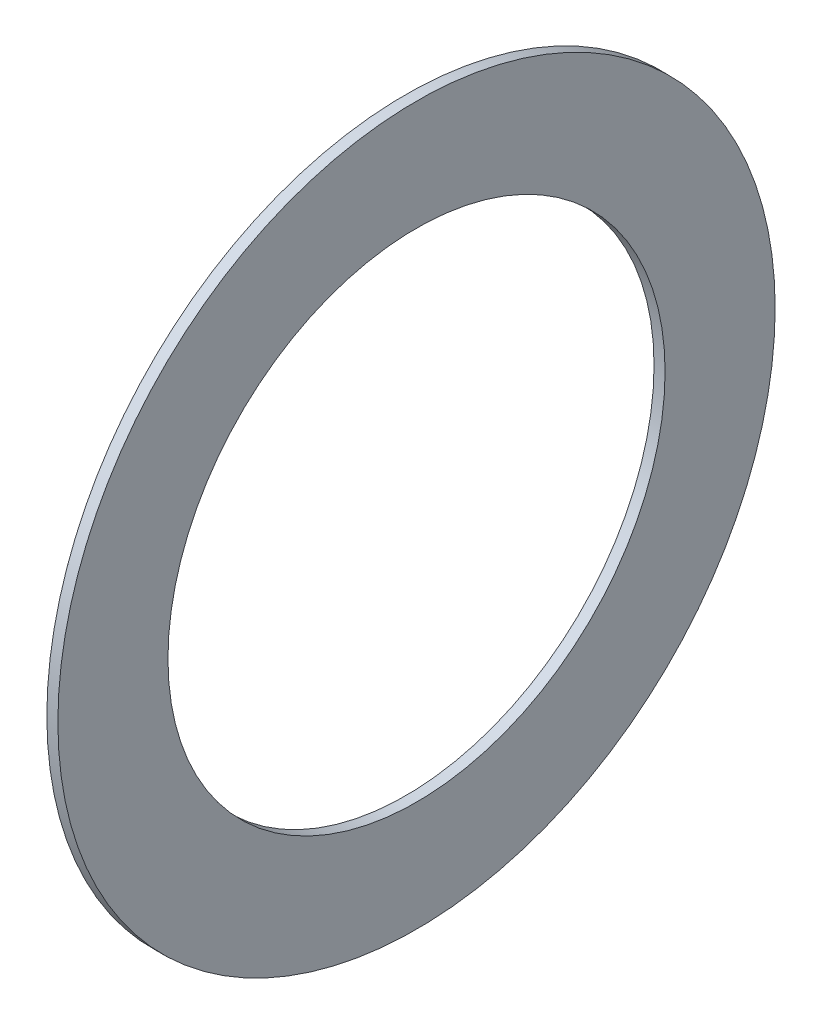
ISO-10303-21;
HEADER;
FILE_DESCRIPTION(('STEP AP214'),'2;1');
FILE_NAME('part.step','',(''),(''),'','','');
FILE_SCHEMA(('AUTOMOTIVE_DESIGN { 1 0 10303 214 1 1 1 1 }'));
ENDSEC;
DATA;
#1=APPLICATION_CONTEXT('core data for automotive mechanical design processes');
#2=APPLICATION_PROTOCOL_DEFINITION('international standard','automotive_design',2000,#1);
#3=PRODUCT_CONTEXT('',#1,'mechanical');
#4=PRODUCT('Part','Part','',(#3));
#5=PRODUCT_RELATED_PRODUCT_CATEGORY('part','',(#4));
#6=PRODUCT_DEFINITION_FORMATION('','',#4);
#7=PRODUCT_DEFINITION_CONTEXT('part definition',#1,'design');
#8=PRODUCT_DEFINITION('design','',#6,#7);
#9=PRODUCT_DEFINITION_SHAPE('','',#8);
#10=(LENGTH_UNIT() NAMED_UNIT(*) SI_UNIT(.MILLI.,.METRE.));
#11=(NAMED_UNIT(*) PLANE_ANGLE_UNIT() SI_UNIT($,.RADIAN.));
#12=(NAMED_UNIT(*) SI_UNIT($,.STERADIAN.) SOLID_ANGLE_UNIT());
#13=UNCERTAINTY_MEASURE_WITH_UNIT(LENGTH_MEASURE(1.E-05),#10,'distance_accuracy_value','');
#14=(GEOMETRIC_REPRESENTATION_CONTEXT(3) GLOBAL_UNCERTAINTY_ASSIGNED_CONTEXT((#13)) GLOBAL_UNIT_ASSIGNED_CONTEXT((#10,
#11,#12)) REPRESENTATION_CONTEXT('',''));
#15=CARTESIAN_POINT('',(0.,0.,0.));
#16=DIRECTION('',(0.,0.,1.));
#17=DIRECTION('',(1.,0.,0.));
#18=AXIS2_PLACEMENT_3D('',#15,#16,#17);
#19=CARTESIAN_POINT('',(0.499999999999973,0.,0.));
#20=DIRECTION('',(1.,0.,0.));
#21=DIRECTION('',(0.,0.,-1.00000000000001));
#22=AXIS2_PLACEMENT_3D('',#19,#20,#21);
#23=PLANE('',#22);
#24=CARTESIAN_POINT('',(0.499999999999973,0.,0.));
#25=DIRECTION('',(1.,0.,0.));
#26=DIRECTION('',(0.,0.,-1.00000000000001));
#27=AXIS2_PLACEMENT_3D('',#24,#25,#26);
#28=CIRCLE('',#27,32.5);
#29=CARTESIAN_POINT('',(0.499999999999973,0.,-32.5000000000004));
#30=VERTEX_POINT('',#29);
#31=EDGE_CURVE('E10',#30,#30,#28,.T.);
#32=ORIENTED_EDGE('',*,*,#31,.T.);
#33=EDGE_LOOP('',(#32));
#34=FACE_BOUND('',#33,.T.);
#35=CARTESIAN_POINT('',(0.499999999999973,0.,0.));
#36=DIRECTION('',(1.,0.,0.));
#37=DIRECTION('',(0.,0.,-1.00000000000001));
#38=AXIS2_PLACEMENT_3D('',#35,#36,#37);
#39=CIRCLE('',#38,22.525);
#40=CARTESIAN_POINT('',(0.499999999999973,0.,-22.5250000000003));
#41=VERTEX_POINT('',#40);
#42=EDGE_CURVE('E44',#41,#41,#39,.T.);
#43=ORIENTED_EDGE('',*,*,#42,.F.);
#44=EDGE_LOOP('',(#43));
#45=FACE_BOUND('',#44,.T.);
#46=ADVANCED_FACE('F37',(#34,#45),#23,.T.);
#47=CARTESIAN_POINT('',(0.499999999999973,0.,0.));
#48=DIRECTION('',(-1.,0.,0.));
#49=DIRECTION('',(0.,0.,1.00000000000001));
#50=AXIS2_PLACEMENT_3D('',#47,#48,#49);
#51=CYLINDRICAL_SURFACE('',#50,32.5);
#52=ORIENTED_EDGE('',*,*,#31,.F.);
#53=EDGE_LOOP('',(#52));
#54=FACE_BOUND('',#53,.T.);
#55=CARTESIAN_POINT('',(-0.500000000000028,0.,0.));
#56=DIRECTION('',(1.,0.,0.));
#57=DIRECTION('',(0.,0.,-1.00000000000001));
#58=AXIS2_PLACEMENT_3D('',#55,#56,#57);
#59=CIRCLE('',#58,32.5);
#60=CARTESIAN_POINT('',(-0.500000000000028,0.,-32.5000000000004));
#61=VERTEX_POINT('',#60);
#62=EDGE_CURVE('E48',#61,#61,#59,.T.);
#63=ORIENTED_EDGE('',*,*,#62,.T.);
#64=EDGE_LOOP('',(#63));
#65=FACE_BOUND('',#64,.T.);
#66=ADVANCED_FACE('F39',(#54,#65),#51,.T.);
#67=CARTESIAN_POINT('',(0.499999999999973,0.,0.));
#68=DIRECTION('',(-1.,0.,0.));
#69=DIRECTION('',(0.,0.,1.00000000000001));
#70=AXIS2_PLACEMENT_3D('',#67,#68,#69);
#71=CYLINDRICAL_SURFACE('',#70,22.525);
#72=ORIENTED_EDGE('',*,*,#42,.T.);
#73=EDGE_LOOP('',(#72));
#74=FACE_BOUND('',#73,.T.);
#75=CARTESIAN_POINT('',(-0.500000000000028,0.,0.));
#76=DIRECTION('',(1.,0.,0.));
#77=DIRECTION('',(0.,0.,-1.00000000000001));
#78=AXIS2_PLACEMENT_3D('',#75,#76,#77);
#79=CIRCLE('',#78,22.525);
#80=CARTESIAN_POINT('',(-0.500000000000028,0.,-22.5250000000003));
#81=VERTEX_POINT('',#80);
#82=EDGE_CURVE('E52',#81,#81,#79,.T.);
#83=ORIENTED_EDGE('',*,*,#82,.F.);
#84=EDGE_LOOP('',(#83));
#85=FACE_BOUND('',#84,.T.);
#86=ADVANCED_FACE('F61',(#74,#85),#71,.F.);
#87=CARTESIAN_POINT('',(-0.500000000000028,0.,0.));
#88=DIRECTION('',(1.,0.,0.));
#89=DIRECTION('',(0.,0.,-1.00000000000001));
#90=AXIS2_PLACEMENT_3D('',#87,#88,#89);
#91=PLANE('',#90);
#92=ORIENTED_EDGE('',*,*,#82,.T.);
#93=EDGE_LOOP('',(#92));
#94=FACE_BOUND('',#93,.T.);
#95=ORIENTED_EDGE('',*,*,#62,.F.);
#96=EDGE_LOOP('',(#95));
#97=FACE_BOUND('',#96,.T.);
#98=ADVANCED_FACE('F58',(#94,#97),#91,.F.);
#99=CLOSED_SHELL('',(#46,#66,#86,#98));
#100=MANIFOLD_SOLID_BREP('B2',#99);
#101=ADVANCED_BREP_SHAPE_REPRESENTATION('',(#18,#100),#14);
#102=SHAPE_DEFINITION_REPRESENTATION(#9,#101);
ENDSEC;
END-ISO-10303-21;
